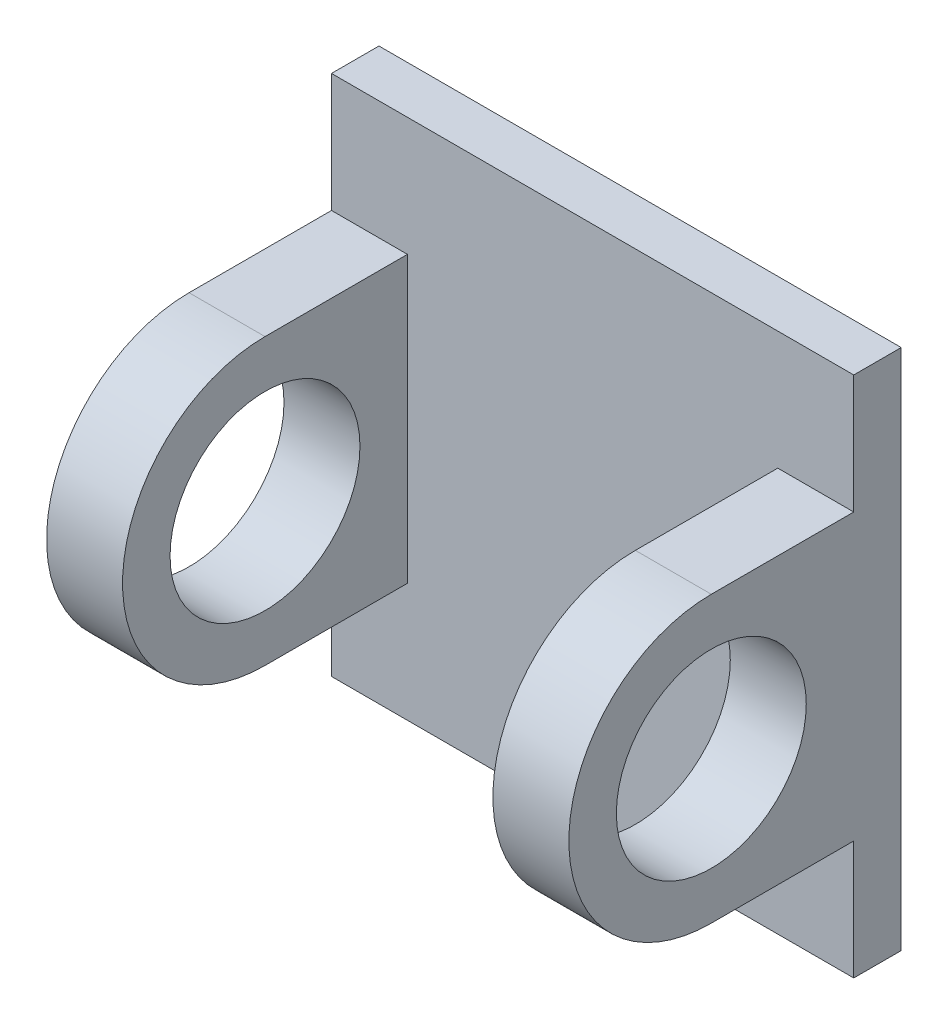
ISO-10303-21;
HEADER;
FILE_DESCRIPTION(('STEP AP214'),'2;1');
FILE_NAME('part.step','',(''),(''),'','','');
FILE_SCHEMA(('AUTOMOTIVE_DESIGN { 1 0 10303 214 1 1 1 1 }'));
ENDSEC;
DATA;
#1=APPLICATION_CONTEXT('core data for automotive mechanical design processes');
#2=APPLICATION_PROTOCOL_DEFINITION('international standard','automotive_design',2000,#1);
#3=PRODUCT_CONTEXT('',#1,'mechanical');
#4=PRODUCT('Part','Part','',(#3));
#5=PRODUCT_RELATED_PRODUCT_CATEGORY('part','',(#4));
#6=PRODUCT_DEFINITION_FORMATION('','',#4);
#7=PRODUCT_DEFINITION_CONTEXT('part definition',#1,'design');
#8=PRODUCT_DEFINITION('design','',#6,#7);
#9=PRODUCT_DEFINITION_SHAPE('','',#8);
#10=(LENGTH_UNIT() NAMED_UNIT(*) SI_UNIT(.MILLI.,.METRE.));
#11=(NAMED_UNIT(*) PLANE_ANGLE_UNIT() SI_UNIT($,.RADIAN.));
#12=(NAMED_UNIT(*) SI_UNIT($,.STERADIAN.) SOLID_ANGLE_UNIT());
#13=UNCERTAINTY_MEASURE_WITH_UNIT(LENGTH_MEASURE(1.E-05),#10,'distance_accuracy_value','');
#14=(GEOMETRIC_REPRESENTATION_CONTEXT(3) GLOBAL_UNCERTAINTY_ASSIGNED_CONTEXT((#13)) GLOBAL_UNIT_ASSIGNED_CONTEXT((#10,
#11,#12)) REPRESENTATION_CONTEXT('',''));
#15=CARTESIAN_POINT('',(0.,0.,0.));
#16=DIRECTION('',(0.,0.,1.));
#17=DIRECTION('',(1.,0.,0.));
#18=AXIS2_PLACEMENT_3D('',#15,#16,#17);
#19=CARTESIAN_POINT('',(-13.75,0.,10.));
#20=DIRECTION('',(1.,0.,0.));
#21=DIRECTION('',(0.,0.,-1.));
#22=AXIS2_PLACEMENT_3D('',#19,#20,#21);
#23=CYLINDRICAL_SURFACE('',#22,7.5);
#24=DIRECTION('',(1.,0.,0.));
#25=VECTOR('',#24,1.);
#26=CARTESIAN_POINT('',(-13.75,-7.5,10.));
#27=LINE('',#26,#25);
#28=CARTESIAN_POINT('',(-13.75,-7.5,10.));
#29=VERTEX_POINT('',#28);
#30=CARTESIAN_POINT('',(-9.75,-7.5,10.));
#31=VERTEX_POINT('',#30);
#32=EDGE_CURVE('E158',#29,#31,#27,.T.);
#33=ORIENTED_EDGE('',*,*,#32,.T.);
#34=CARTESIAN_POINT('',(-9.75,0.,10.));
#35=DIRECTION('',(1.,0.,0.));
#36=DIRECTION('',(0.,0.,-1.));
#37=AXIS2_PLACEMENT_3D('',#34,#35,#36);
#38=CIRCLE('',#37,7.5);
#39=CARTESIAN_POINT('',(-9.75,7.5,10.));
#40=VERTEX_POINT('',#39);
#41=EDGE_CURVE('E202',#31,#40,#38,.F.);
#42=ORIENTED_EDGE('',*,*,#41,.T.);
#43=DIRECTION('',(1.,0.,0.));
#44=VECTOR('',#43,1.);
#45=CARTESIAN_POINT('',(-13.75,7.5,10.));
#46=LINE('',#45,#44);
#47=CARTESIAN_POINT('',(-13.75,7.5,10.));
#48=VERTEX_POINT('',#47);
#49=EDGE_CURVE('E155',#48,#40,#46,.T.);
#50=ORIENTED_EDGE('',*,*,#49,.F.);
#51=CARTESIAN_POINT('',(-13.75,0.,10.));
#52=DIRECTION('',(1.,0.,0.));
#53=DIRECTION('',(0.,0.,-1.));
#54=AXIS2_PLACEMENT_3D('',#51,#52,#53);
#55=CIRCLE('',#54,7.5);
#56=EDGE_CURVE('E215',#48,#29,#55,.T.);
#57=ORIENTED_EDGE('',*,*,#56,.T.);
#58=EDGE_LOOP('',(#33,#42,#50,#57));
#59=FACE_BOUND('',#58,.T.);
#60=ADVANCED_FACE('F40',(#59),#23,.T.);
#61=CARTESIAN_POINT('',(9.75,7.5,10.));
#62=VERTEX_POINT('',#61);
#63=CARTESIAN_POINT('',(13.75,7.5,10.));
#64=VERTEX_POINT('',#63);
#65=EDGE_CURVE('E151',#62,#64,#46,.T.);
#66=ORIENTED_EDGE('',*,*,#65,.F.);
#67=CARTESIAN_POINT('',(9.75,0.,10.));
#68=DIRECTION('',(-1.,0.,0.));
#69=DIRECTION('',(0.,0.,1.));
#70=AXIS2_PLACEMENT_3D('',#67,#68,#69);
#71=CIRCLE('',#70,7.5);
#72=CARTESIAN_POINT('',(9.75,-7.5,10.));
#73=VERTEX_POINT('',#72);
#74=EDGE_CURVE('E133',#62,#73,#71,.F.);
#75=ORIENTED_EDGE('',*,*,#74,.T.);
#76=CARTESIAN_POINT('',(13.75,-7.5,10.));
#77=VERTEX_POINT('',#76);
#78=EDGE_CURVE('E161',#73,#77,#27,.T.);
#79=ORIENTED_EDGE('',*,*,#78,.T.);
#80=CARTESIAN_POINT('',(13.75,0.,10.));
#81=DIRECTION('',(1.,0.,0.));
#82=DIRECTION('',(0.,0.,-1.));
#83=AXIS2_PLACEMENT_3D('',#80,#81,#82);
#84=CIRCLE('',#83,7.5);
#85=EDGE_CURVE('E212',#64,#77,#84,.T.);
#86=ORIENTED_EDGE('',*,*,#85,.F.);
#87=EDGE_LOOP('',(#66,#75,#79,#86));
#88=FACE_BOUND('',#87,.T.);
#89=ADVANCED_FACE('F259',(#88),#23,.T.);
#90=CARTESIAN_POINT('',(-13.75,7.5,2.5));
#91=DIRECTION('',(0.,1.,0.));
#92=DIRECTION('',(0.,0.,1.));
#93=AXIS2_PLACEMENT_3D('',#90,#91,#92);
#94=PLANE('',#93);
#95=ORIENTED_EDGE('',*,*,#49,.T.);
#96=DIRECTION('',(0.,0.,-1.));
#97=VECTOR('',#96,1.);
#98=CARTESIAN_POINT('',(-9.75,7.5,2.5));
#99=LINE('',#98,#97);
#100=CARTESIAN_POINT('',(-9.75,7.5,2.5));
#101=VERTEX_POINT('',#100);
#102=EDGE_CURVE('E205',#40,#101,#99,.T.);
#103=ORIENTED_EDGE('',*,*,#102,.T.);
#104=DIRECTION('',(1.,0.,0.));
#105=VECTOR('',#104,1.);
#106=CARTESIAN_POINT('',(-13.75,7.5,2.5));
#107=LINE('',#106,#105);
#108=CARTESIAN_POINT('',(-13.75,7.5,2.5));
#109=VERTEX_POINT('',#108);
#110=EDGE_CURVE('E147',#109,#101,#107,.T.);
#111=ORIENTED_EDGE('',*,*,#110,.F.);
#112=DIRECTION('',(0.,0.,1.));
#113=VECTOR('',#112,1.);
#114=CARTESIAN_POINT('',(-13.75,7.5,2.5));
#115=LINE('',#114,#113);
#116=EDGE_CURVE('E220',#109,#48,#115,.T.);
#117=ORIENTED_EDGE('',*,*,#116,.T.);
#118=EDGE_LOOP('',(#95,#103,#111,#117));
#119=FACE_BOUND('',#118,.T.);
#120=ADVANCED_FACE('F282',(#119),#94,.T.);
#121=CARTESIAN_POINT('',(9.74999999999999,7.5,2.5));
#122=VERTEX_POINT('',#121);
#123=CARTESIAN_POINT('',(13.75,7.5,2.5));
#124=VERTEX_POINT('',#123);
#125=EDGE_CURVE('E64',#122,#124,#107,.T.);
#126=ORIENTED_EDGE('',*,*,#125,.F.);
#127=DIRECTION('',(0.,0.,1.));
#128=VECTOR('',#127,1.);
#129=CARTESIAN_POINT('',(9.75,7.5,2.5));
#130=LINE('',#129,#128);
#131=EDGE_CURVE('E129',#122,#62,#130,.T.);
#132=ORIENTED_EDGE('',*,*,#131,.T.);
#133=ORIENTED_EDGE('',*,*,#65,.T.);
#134=DIRECTION('',(0.,0.,1.));
#135=VECTOR('',#134,1.);
#136=CARTESIAN_POINT('',(13.75,7.5,2.5));
#137=LINE('',#136,#135);
#138=EDGE_CURVE('E145',#124,#64,#137,.T.);
#139=ORIENTED_EDGE('',*,*,#138,.F.);
#140=EDGE_LOOP('',(#126,#132,#133,#139));
#141=FACE_BOUND('',#140,.T.);
#142=ADVANCED_FACE('F143',(#141),#94,.T.);
#143=CARTESIAN_POINT('',(-13.75,-7.5,2.5));
#144=DIRECTION('',(0.,-1.,0.));
#145=DIRECTION('',(0.,0.,-1.));
#146=AXIS2_PLACEMENT_3D('',#143,#144,#145);
#147=PLANE('',#146);
#148=DIRECTION('',(1.,0.,0.));
#149=VECTOR('',#148,1.);
#150=CARTESIAN_POINT('',(-13.75,-7.5,2.5));
#151=LINE('',#150,#149);
#152=CARTESIAN_POINT('',(-13.75,-7.5,2.5));
#153=VERTEX_POINT('',#152);
#154=CARTESIAN_POINT('',(-9.75,-7.5,2.5));
#155=VERTEX_POINT('',#154);
#156=EDGE_CURVE('E148',#153,#155,#151,.T.);
#157=ORIENTED_EDGE('',*,*,#156,.T.);
#158=DIRECTION('',(0.,0.,1.));
#159=VECTOR('',#158,1.);
#160=CARTESIAN_POINT('',(-9.75,-7.5,2.5));
#161=LINE('',#160,#159);
#162=EDGE_CURVE('E199',#155,#31,#161,.T.);
#163=ORIENTED_EDGE('',*,*,#162,.T.);
#164=ORIENTED_EDGE('',*,*,#32,.F.);
#165=DIRECTION('',(0.,0.,-1.));
#166=VECTOR('',#165,1.);
#167=CARTESIAN_POINT('',(-13.75,-7.5,2.5));
#168=LINE('',#167,#166);
#169=EDGE_CURVE('E218',#29,#153,#168,.T.);
#170=ORIENTED_EDGE('',*,*,#169,.T.);
#171=EDGE_LOOP('',(#157,#163,#164,#170));
#172=FACE_BOUND('',#171,.T.);
#173=ADVANCED_FACE('F266',(#172),#147,.T.);
#174=ORIENTED_EDGE('',*,*,#78,.F.);
#175=DIRECTION('',(0.,0.,-1.));
#176=VECTOR('',#175,1.);
#177=CARTESIAN_POINT('',(9.75,-7.5,2.5));
#178=LINE('',#177,#176);
#179=CARTESIAN_POINT('',(9.75,-7.5,2.5));
#180=VERTEX_POINT('',#179);
#181=EDGE_CURVE('E191',#73,#180,#178,.T.);
#182=ORIENTED_EDGE('',*,*,#181,.T.);
#183=CARTESIAN_POINT('',(13.75,-7.5,2.5));
#184=VERTEX_POINT('',#183);
#185=EDGE_CURVE('E140',#180,#184,#151,.T.);
#186=ORIENTED_EDGE('',*,*,#185,.T.);
#187=DIRECTION('',(0.,0.,-1.));
#188=VECTOR('',#187,1.);
#189=CARTESIAN_POINT('',(13.75,-7.5,2.5));
#190=LINE('',#189,#188);
#191=EDGE_CURVE('E225',#77,#184,#190,.T.);
#192=ORIENTED_EDGE('',*,*,#191,.F.);
#193=EDGE_LOOP('',(#174,#182,#186,#192));
#194=FACE_BOUND('',#193,.T.);
#195=ADVANCED_FACE('F263',(#194),#147,.T.);
#196=CARTESIAN_POINT('',(-13.75,0.,10.));
#197=DIRECTION('',(1.,0.,0.));
#198=DIRECTION('',(0.,0.,-1.));
#199=AXIS2_PLACEMENT_3D('',#196,#197,#198);
#200=CYLINDRICAL_SURFACE('',#199,5.);
#201=CARTESIAN_POINT('',(-13.75,0.,10.));
#202=DIRECTION('',(1.,0.,0.));
#203=DIRECTION('',(0.,0.,-1.));
#204=AXIS2_PLACEMENT_3D('',#201,#202,#203);
#205=CIRCLE('',#204,5.);
#206=CARTESIAN_POINT('',(-13.75,0.,5.));
#207=VERTEX_POINT('',#206);
#208=EDGE_CURVE('E209',#207,#207,#205,.T.);
#209=ORIENTED_EDGE('',*,*,#208,.F.);
#210=EDGE_LOOP('',(#209));
#211=FACE_BOUND('',#210,.T.);
#212=CARTESIAN_POINT('',(-9.75,0.,10.));
#213=DIRECTION('',(1.,0.,0.));
#214=DIRECTION('',(0.,0.,-1.));
#215=AXIS2_PLACEMENT_3D('',#212,#213,#214);
#216=CIRCLE('',#215,5.);
#217=CARTESIAN_POINT('',(-9.75,0.,5.));
#218=VERTEX_POINT('',#217);
#219=EDGE_CURVE('E44',#218,#218,#216,.F.);
#220=ORIENTED_EDGE('',*,*,#219,.F.);
#221=EDGE_LOOP('',(#220));
#222=FACE_BOUND('',#221,.T.);
#223=ADVANCED_FACE('F265',(#211,#222),#200,.F.);
#224=CARTESIAN_POINT('',(13.75,0.,10.));
#225=DIRECTION('',(1.,0.,0.));
#226=DIRECTION('',(0.,0.,-1.));
#227=AXIS2_PLACEMENT_3D('',#224,#225,#226);
#228=CIRCLE('',#227,5.);
#229=CARTESIAN_POINT('',(13.75,0.,5.));
#230=VERTEX_POINT('',#229);
#231=EDGE_CURVE('E208',#230,#230,#228,.T.);
#232=ORIENTED_EDGE('',*,*,#231,.T.);
#233=EDGE_LOOP('',(#232));
#234=FACE_BOUND('',#233,.T.);
#235=CARTESIAN_POINT('',(9.75,0.,10.));
#236=DIRECTION('',(-1.,0.,0.));
#237=DIRECTION('',(0.,0.,1.));
#238=AXIS2_PLACEMENT_3D('',#235,#236,#237);
#239=CIRCLE('',#238,5.);
#240=CARTESIAN_POINT('',(9.75,0.,15.));
#241=VERTEX_POINT('',#240);
#242=EDGE_CURVE('E189',#241,#241,#239,.F.);
#243=ORIENTED_EDGE('',*,*,#242,.F.);
#244=EDGE_LOOP('',(#243));
#245=FACE_BOUND('',#244,.T.);
#246=ADVANCED_FACE('F272',(#234,#245),#200,.F.);
#247=CARTESIAN_POINT('',(13.75,13.75,2.5));
#248=DIRECTION('',(0.,-1.,0.));
#249=DIRECTION('',(0.,0.,-1.));
#250=AXIS2_PLACEMENT_3D('',#247,#248,#249);
#251=PLANE('',#250);
#252=DIRECTION('',(-1.,0.,0.));
#253=VECTOR('',#252,1.);
#254=CARTESIAN_POINT('',(13.75,13.75,0.));
#255=LINE('',#254,#253);
#256=CARTESIAN_POINT('',(13.75,13.75,0.));
#257=VERTEX_POINT('',#256);
#258=CARTESIAN_POINT('',(-13.75,13.75,0.));
#259=VERTEX_POINT('',#258);
#260=EDGE_CURVE('E175',#257,#259,#255,.T.);
#261=ORIENTED_EDGE('',*,*,#260,.T.);
#262=DIRECTION('',(0.,0.,-1.));
#263=VECTOR('',#262,1.);
#264=CARTESIAN_POINT('',(-13.75,13.75,2.5));
#265=LINE('',#264,#263);
#266=CARTESIAN_POINT('',(-13.75,13.75,2.5));
#267=VERTEX_POINT('',#266);
#268=EDGE_CURVE('E12',#267,#259,#265,.T.);
#269=ORIENTED_EDGE('',*,*,#268,.F.);
#270=DIRECTION('',(-1.,0.,0.));
#271=VECTOR('',#270,1.);
#272=CARTESIAN_POINT('',(13.75,13.75,2.5));
#273=LINE('',#272,#271);
#274=CARTESIAN_POINT('',(13.75,13.75,2.5));
#275=VERTEX_POINT('',#274);
#276=EDGE_CURVE('E162',#275,#267,#273,.T.);
#277=ORIENTED_EDGE('',*,*,#276,.F.);
#278=DIRECTION('',(0.,0.,-1.));
#279=VECTOR('',#278,1.);
#280=CARTESIAN_POINT('',(13.75,13.75,2.5));
#281=LINE('',#280,#279);
#282=EDGE_CURVE('E174',#275,#257,#281,.T.);
#283=ORIENTED_EDGE('',*,*,#282,.T.);
#284=EDGE_LOOP('',(#261,#269,#277,#283));
#285=FACE_BOUND('',#284,.T.);
#286=ADVANCED_FACE('F42',(#285),#251,.F.);
#287=CARTESIAN_POINT('',(-13.75,-13.75,2.5));
#288=DIRECTION('',(1.,0.,0.));
#289=DIRECTION('',(0.,0.,-1.));
#290=AXIS2_PLACEMENT_3D('',#287,#288,#289);
#291=PLANE('',#290);
#292=DIRECTION('',(0.,-1.,0.));
#293=VECTOR('',#292,1.);
#294=CARTESIAN_POINT('',(-13.75,-13.75,0.));
#295=LINE('',#294,#293);
#296=CARTESIAN_POINT('',(-13.75,-13.75,0.));
#297=VERTEX_POINT('',#296);
#298=EDGE_CURVE('E178',#259,#297,#295,.T.);
#299=ORIENTED_EDGE('',*,*,#298,.T.);
#300=DIRECTION('',(0.,0.,-1.));
#301=VECTOR('',#300,1.);
#302=CARTESIAN_POINT('',(-13.75,-13.75,2.5));
#303=LINE('',#302,#301);
#304=CARTESIAN_POINT('',(-13.75,-13.75,2.5));
#305=VERTEX_POINT('',#304);
#306=EDGE_CURVE('E49',#305,#297,#303,.T.);
#307=ORIENTED_EDGE('',*,*,#306,.F.);
#308=DIRECTION('',(0.,-1.,0.));
#309=VECTOR('',#308,1.);
#310=CARTESIAN_POINT('',(-13.75,-13.75,2.5));
#311=LINE('',#310,#309);
#312=EDGE_CURVE('E164',#153,#305,#311,.T.);
#313=ORIENTED_EDGE('',*,*,#312,.F.);
#314=ORIENTED_EDGE('',*,*,#169,.F.);
#315=ORIENTED_EDGE('',*,*,#56,.F.);
#316=ORIENTED_EDGE('',*,*,#116,.F.);
#317=EDGE_CURVE('E166',#267,#109,#311,.T.);
#318=ORIENTED_EDGE('',*,*,#317,.F.);
#319=ORIENTED_EDGE('',*,*,#268,.T.);
#320=EDGE_LOOP('',(#299,#307,#313,#314,#315,#316,#318,#319));
#321=FACE_BOUND('',#320,.T.);
#322=ORIENTED_EDGE('',*,*,#208,.T.);
#323=EDGE_LOOP('',(#322));
#324=FACE_BOUND('',#323,.T.);
#325=ADVANCED_FACE('F238',(#321,#324),#291,.F.);
#326=CARTESIAN_POINT('',(13.75,-13.75,2.5));
#327=DIRECTION('',(0.,1.,0.));
#328=DIRECTION('',(0.,0.,1.));
#329=AXIS2_PLACEMENT_3D('',#326,#327,#328);
#330=PLANE('',#329);
#331=DIRECTION('',(1.,0.,0.));
#332=VECTOR('',#331,1.);
#333=CARTESIAN_POINT('',(13.75,-13.75,0.));
#334=LINE('',#333,#332);
#335=CARTESIAN_POINT('',(13.75,-13.75,0.));
#336=VERTEX_POINT('',#335);
#337=EDGE_CURVE('E180',#297,#336,#334,.T.);
#338=ORIENTED_EDGE('',*,*,#337,.T.);
#339=DIRECTION('',(0.,0.,-1.));
#340=VECTOR('',#339,1.);
#341=CARTESIAN_POINT('',(13.75,-13.75,2.5));
#342=LINE('',#341,#340);
#343=CARTESIAN_POINT('',(13.75,-13.75,2.5));
#344=VERTEX_POINT('',#343);
#345=EDGE_CURVE('E185',#344,#336,#342,.T.);
#346=ORIENTED_EDGE('',*,*,#345,.F.);
#347=DIRECTION('',(1.,0.,0.));
#348=VECTOR('',#347,1.);
#349=CARTESIAN_POINT('',(13.75,-13.75,2.5));
#350=LINE('',#349,#348);
#351=EDGE_CURVE('E169',#305,#344,#350,.T.);
#352=ORIENTED_EDGE('',*,*,#351,.F.);
#353=ORIENTED_EDGE('',*,*,#306,.T.);
#354=EDGE_LOOP('',(#338,#346,#352,#353));
#355=FACE_BOUND('',#354,.T.);
#356=ADVANCED_FACE('F250',(#355),#330,.F.);
#357=CARTESIAN_POINT('',(13.75,-13.75,2.5));
#358=DIRECTION('',(-1.,0.,0.));
#359=DIRECTION('',(0.,0.,1.));
#360=AXIS2_PLACEMENT_3D('',#357,#358,#359);
#361=PLANE('',#360);
#362=DIRECTION('',(0.,1.,0.));
#363=VECTOR('',#362,1.);
#364=CARTESIAN_POINT('',(13.75,-13.75,0.));
#365=LINE('',#364,#363);
#366=EDGE_CURVE('E165',#336,#257,#365,.T.);
#367=ORIENTED_EDGE('',*,*,#366,.T.);
#368=ORIENTED_EDGE('',*,*,#282,.F.);
#369=DIRECTION('',(0.,1.,0.));
#370=VECTOR('',#369,1.);
#371=CARTESIAN_POINT('',(13.75,-13.75,2.5));
#372=LINE('',#371,#370);
#373=EDGE_CURVE('E171',#124,#275,#372,.T.);
#374=ORIENTED_EDGE('',*,*,#373,.F.);
#375=ORIENTED_EDGE('',*,*,#138,.T.);
#376=ORIENTED_EDGE('',*,*,#85,.T.);
#377=ORIENTED_EDGE('',*,*,#191,.T.);
#378=EDGE_CURVE('E172',#344,#184,#372,.T.);
#379=ORIENTED_EDGE('',*,*,#378,.F.);
#380=ORIENTED_EDGE('',*,*,#345,.T.);
#381=EDGE_LOOP('',(#367,#368,#374,#375,#376,#377,#379,#380));
#382=FACE_BOUND('',#381,.T.);
#383=ORIENTED_EDGE('',*,*,#231,.F.);
#384=EDGE_LOOP('',(#383));
#385=FACE_BOUND('',#384,.T.);
#386=ADVANCED_FACE('F228',(#382,#385),#361,.F.);
#387=CARTESIAN_POINT('',(0.,0.,2.5));
#388=DIRECTION('',(0.,0.,-1.));
#389=DIRECTION('',(-1.,0.,0.));
#390=AXIS2_PLACEMENT_3D('',#387,#388,#389);
#391=PLANE('',#390);
#392=ORIENTED_EDGE('',*,*,#276,.T.);
#393=ORIENTED_EDGE('',*,*,#317,.T.);
#394=ORIENTED_EDGE('',*,*,#110,.T.);
#395=DIRECTION('',(0.,-1.,0.));
#396=VECTOR('',#395,1.);
#397=CARTESIAN_POINT('',(-9.75,-13.75,2.5));
#398=LINE('',#397,#396);
#399=EDGE_CURVE('E141',#101,#155,#398,.T.);
#400=ORIENTED_EDGE('',*,*,#399,.T.);
#401=ORIENTED_EDGE('',*,*,#156,.F.);
#402=ORIENTED_EDGE('',*,*,#312,.T.);
#403=ORIENTED_EDGE('',*,*,#351,.T.);
#404=ORIENTED_EDGE('',*,*,#378,.T.);
#405=ORIENTED_EDGE('',*,*,#185,.F.);
#406=DIRECTION('',(0.,-1.,0.));
#407=VECTOR('',#406,1.);
#408=CARTESIAN_POINT('',(9.74999999999999,-13.75,2.5));
#409=LINE('',#408,#407);
#410=EDGE_CURVE('E57',#122,#180,#409,.T.);
#411=ORIENTED_EDGE('',*,*,#410,.F.);
#412=ORIENTED_EDGE('',*,*,#125,.T.);
#413=ORIENTED_EDGE('',*,*,#373,.T.);
#414=EDGE_LOOP('',(#392,#393,#394,#400,#401,#402,#403,#404,#405,#411,#412,#413));
#415=FACE_BOUND('',#414,.T.);
#416=ADVANCED_FACE('F138',(#415),#391,.F.);
#417=CARTESIAN_POINT('',(0.,0.,0.));
#418=DIRECTION('',(0.,0.,-1.));
#419=DIRECTION('',(-1.,0.,0.));
#420=AXIS2_PLACEMENT_3D('',#417,#418,#419);
#421=PLANE('',#420);
#422=ORIENTED_EDGE('',*,*,#260,.F.);
#423=ORIENTED_EDGE('',*,*,#366,.F.);
#424=ORIENTED_EDGE('',*,*,#337,.F.);
#425=ORIENTED_EDGE('',*,*,#298,.F.);
#426=EDGE_LOOP('',(#422,#423,#424,#425));
#427=FACE_BOUND('',#426,.T.);
#428=ADVANCED_FACE('F244',(#427),#421,.T.);
#429=CARTESIAN_POINT('',(-9.75,-13.75,2.5));
#430=DIRECTION('',(1.,0.,0.));
#431=DIRECTION('',(0.,0.,-1.));
#432=AXIS2_PLACEMENT_3D('',#429,#430,#431);
#433=PLANE('',#432);
#434=ORIENTED_EDGE('',*,*,#41,.F.);
#435=ORIENTED_EDGE('',*,*,#162,.F.);
#436=ORIENTED_EDGE('',*,*,#399,.F.);
#437=ORIENTED_EDGE('',*,*,#102,.F.);
#438=EDGE_LOOP('',(#434,#435,#436,#437));
#439=FACE_BOUND('',#438,.T.);
#440=ORIENTED_EDGE('',*,*,#219,.T.);
#441=EDGE_LOOP('',(#440));
#442=FACE_BOUND('',#441,.T.);
#443=ADVANCED_FACE('F288',(#439,#442),#433,.T.);
#444=CARTESIAN_POINT('',(9.75,-13.75,2.5));
#445=DIRECTION('',(-1.,0.,0.));
#446=DIRECTION('',(0.,0.,1.));
#447=AXIS2_PLACEMENT_3D('',#444,#445,#446);
#448=PLANE('',#447);
#449=ORIENTED_EDGE('',*,*,#410,.T.);
#450=ORIENTED_EDGE('',*,*,#181,.F.);
#451=ORIENTED_EDGE('',*,*,#74,.F.);
#452=ORIENTED_EDGE('',*,*,#131,.F.);
#453=EDGE_LOOP('',(#449,#450,#451,#452));
#454=FACE_BOUND('',#453,.T.);
#455=ORIENTED_EDGE('',*,*,#242,.T.);
#456=EDGE_LOOP('',(#455));
#457=FACE_BOUND('',#456,.T.);
#458=ADVANCED_FACE('F130',(#454,#457),#448,.T.);
#459=CLOSED_SHELL('',(#60,#89,#120,#142,#173,#195,#223,#246,#286,#325,#356,#386,#416,#428,#443,#458));
#460=MANIFOLD_SOLID_BREP('B2',#459);
#461=ADVANCED_BREP_SHAPE_REPRESENTATION('',(#18,#460),#14);
#462=SHAPE_DEFINITION_REPRESENTATION(#9,#461);
ENDSEC;
END-ISO-10303-21;
